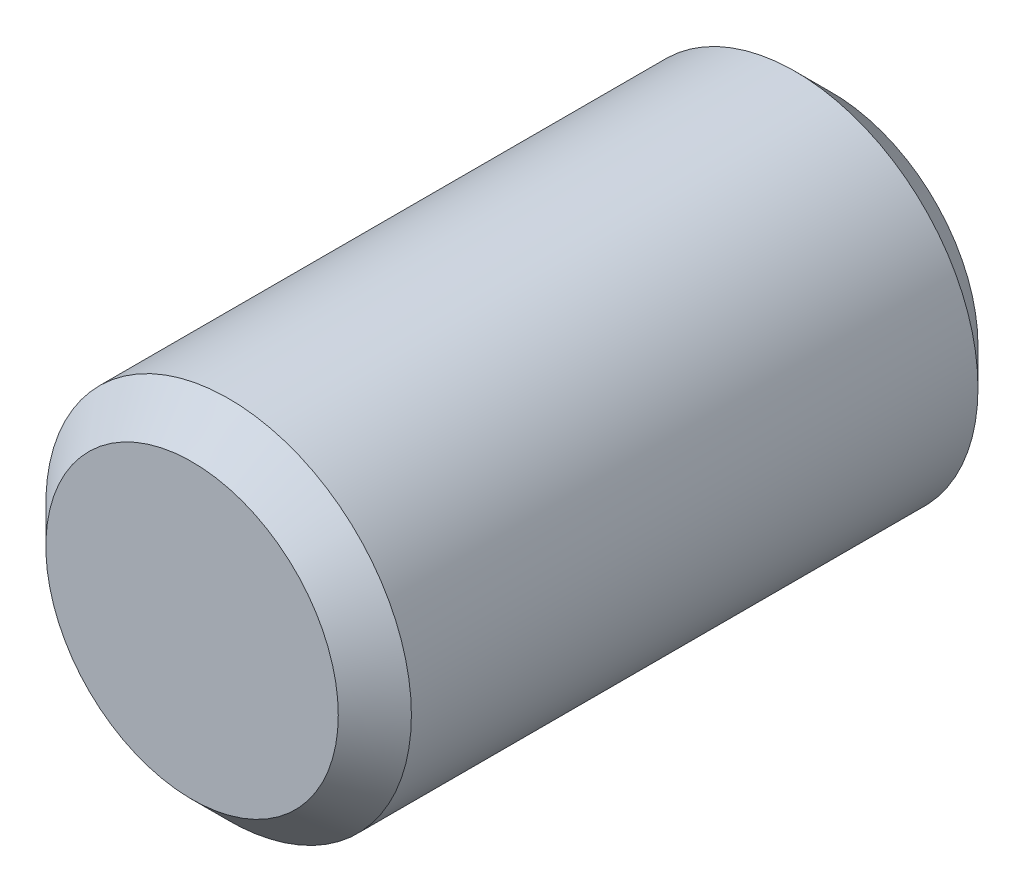
ISO-10303-21;
HEADER;
FILE_DESCRIPTION(('STEP AP214'),'2;1');
FILE_NAME('part.step','',(''),(''),'','','');
FILE_SCHEMA(('AUTOMOTIVE_DESIGN { 1 0 10303 214 1 1 1 1 }'));
ENDSEC;
DATA;
#1=APPLICATION_CONTEXT('core data for automotive mechanical design processes');
#2=APPLICATION_PROTOCOL_DEFINITION('international standard','automotive_design',2000,#1);
#3=PRODUCT_CONTEXT('',#1,'mechanical');
#4=PRODUCT('Part','Part','',(#3));
#5=PRODUCT_RELATED_PRODUCT_CATEGORY('part','',(#4));
#6=PRODUCT_DEFINITION_FORMATION('','',#4);
#7=PRODUCT_DEFINITION_CONTEXT('part definition',#1,'design');
#8=PRODUCT_DEFINITION('design','',#6,#7);
#9=PRODUCT_DEFINITION_SHAPE('','',#8);
#10=(LENGTH_UNIT() NAMED_UNIT(*) SI_UNIT(.MILLI.,.METRE.));
#11=(NAMED_UNIT(*) PLANE_ANGLE_UNIT() SI_UNIT($,.RADIAN.));
#12=(NAMED_UNIT(*) SI_UNIT($,.STERADIAN.) SOLID_ANGLE_UNIT());
#13=UNCERTAINTY_MEASURE_WITH_UNIT(LENGTH_MEASURE(1.E-05),#10,'distance_accuracy_value','');
#14=(GEOMETRIC_REPRESENTATION_CONTEXT(3) GLOBAL_UNCERTAINTY_ASSIGNED_CONTEXT((#13)) GLOBAL_UNIT_ASSIGNED_CONTEXT((#10,
#11,#12)) REPRESENTATION_CONTEXT('',''));
#15=CARTESIAN_POINT('',(0.,0.,0.));
#16=DIRECTION('',(0.,0.,1.));
#17=DIRECTION('',(1.,0.,0.));
#18=AXIS2_PLACEMENT_3D('',#15,#16,#17);
#19=CARTESIAN_POINT('',(0.,0.,8.75));
#20=DIRECTION('',(0.,0.,-1.));
#21=DIRECTION('',(-1.,0.,0.));
#22=AXIS2_PLACEMENT_3D('',#19,#20,#21);
#23=CYLINDRICAL_SURFACE('',#22,5.);
#24=CARTESIAN_POINT('',(0.,0.,-7.75000000000001));
#25=DIRECTION('',(0.,0.,1.));
#26=DIRECTION('',(1.,0.,0.));
#27=AXIS2_PLACEMENT_3D('',#24,#25,#26);
#28=CIRCLE('',#27,5.);
#29=CARTESIAN_POINT('',(5.,0.,-7.75000000000001));
#30=VERTEX_POINT('',#29);
#31=EDGE_CURVE('E46',#30,#30,#28,.T.);
#32=ORIENTED_EDGE('',*,*,#31,.T.);
#33=EDGE_LOOP('',(#32));
#34=FACE_BOUND('',#33,.T.);
#35=CARTESIAN_POINT('',(0.,0.,7.75));
#36=DIRECTION('',(0.,0.,1.));
#37=DIRECTION('',(1.,0.,0.));
#38=AXIS2_PLACEMENT_3D('',#35,#36,#37);
#39=CIRCLE('',#38,5.);
#40=CARTESIAN_POINT('',(5.,0.,7.75));
#41=VERTEX_POINT('',#40);
#42=EDGE_CURVE('E50',#41,#41,#39,.F.);
#43=ORIENTED_EDGE('',*,*,#42,.T.);
#44=EDGE_LOOP('',(#43));
#45=FACE_BOUND('',#44,.T.);
#46=ADVANCED_FACE('F34',(#34,#45),#23,.T.);
#47=CARTESIAN_POINT('',(0.,0.,8.75));
#48=DIRECTION('',(0.,0.,1.));
#49=DIRECTION('',(1.,0.,0.));
#50=AXIS2_PLACEMENT_3D('',#47,#48,#49);
#51=PLANE('',#50);
#52=CARTESIAN_POINT('',(0.,0.,8.75));
#53=DIRECTION('',(0.,0.,1.));
#54=DIRECTION('',(1.,0.,0.));
#55=AXIS2_PLACEMENT_3D('',#52,#53,#54);
#56=CIRCLE('',#55,4.);
#57=CARTESIAN_POINT('',(4.,0.,8.75));
#58=VERTEX_POINT('',#57);
#59=EDGE_CURVE('E10',#58,#58,#56,.T.);
#60=ORIENTED_EDGE('',*,*,#59,.T.);
#61=EDGE_LOOP('',(#60));
#62=FACE_BOUND('',#61,.T.);
#63=ADVANCED_FACE('F66',(#62),#51,.T.);
#64=CARTESIAN_POINT('',(0.,0.,-8.75));
#65=DIRECTION('',(0.,0.,1.));
#66=DIRECTION('',(1.,0.,0.));
#67=AXIS2_PLACEMENT_3D('',#64,#65,#66);
#68=PLANE('',#67);
#69=CARTESIAN_POINT('',(0.,0.,-8.75));
#70=DIRECTION('',(0.,0.,1.));
#71=DIRECTION('',(1.,0.,0.));
#72=AXIS2_PLACEMENT_3D('',#69,#70,#71);
#73=CIRCLE('',#72,4.);
#74=CARTESIAN_POINT('',(4.,0.,-8.75));
#75=VERTEX_POINT('',#74);
#76=EDGE_CURVE('E42',#75,#75,#73,.F.);
#77=ORIENTED_EDGE('',*,*,#76,.T.);
#78=EDGE_LOOP('',(#77));
#79=FACE_BOUND('',#78,.T.);
#80=ADVANCED_FACE('F63',(#79),#68,.F.);
#81=CARTESIAN_POINT('',(0.,0.,-7.75000000000001));
#82=DIRECTION('',(0.,0.,1.));
#83=DIRECTION('',(1.,0.,0.));
#84=AXIS2_PLACEMENT_3D('',#81,#82,#83);
#85=CONICAL_SURFACE('',#84,5.,0.785398163397451);
#86=ORIENTED_EDGE('',*,*,#76,.F.);
#87=EDGE_LOOP('',(#86));
#88=FACE_BOUND('',#87,.T.);
#89=ORIENTED_EDGE('',*,*,#31,.F.);
#90=EDGE_LOOP('',(#89));
#91=FACE_BOUND('',#90,.T.);
#92=ADVANCED_FACE('F59',(#88,#91),#85,.T.);
#93=CARTESIAN_POINT('',(0.,0.,8.75));
#94=DIRECTION('',(0.,0.,-1.));
#95=DIRECTION('',(-1.,0.,0.));
#96=AXIS2_PLACEMENT_3D('',#93,#94,#95);
#97=CONICAL_SURFACE('',#96,4.,0.785398163397447);
#98=ORIENTED_EDGE('',*,*,#42,.F.);
#99=EDGE_LOOP('',(#98));
#100=FACE_BOUND('',#99,.T.);
#101=ORIENTED_EDGE('',*,*,#59,.F.);
#102=EDGE_LOOP('',(#101));
#103=FACE_BOUND('',#102,.T.);
#104=ADVANCED_FACE('F37',(#100,#103),#97,.T.);
#105=CLOSED_SHELL('',(#46,#63,#80,#92,#104));
#106=MANIFOLD_SOLID_BREP('B2',#105);
#107=ADVANCED_BREP_SHAPE_REPRESENTATION('',(#18,#106),#14);
#108=SHAPE_DEFINITION_REPRESENTATION(#9,#107);
ENDSEC;
END-ISO-10303-21;
